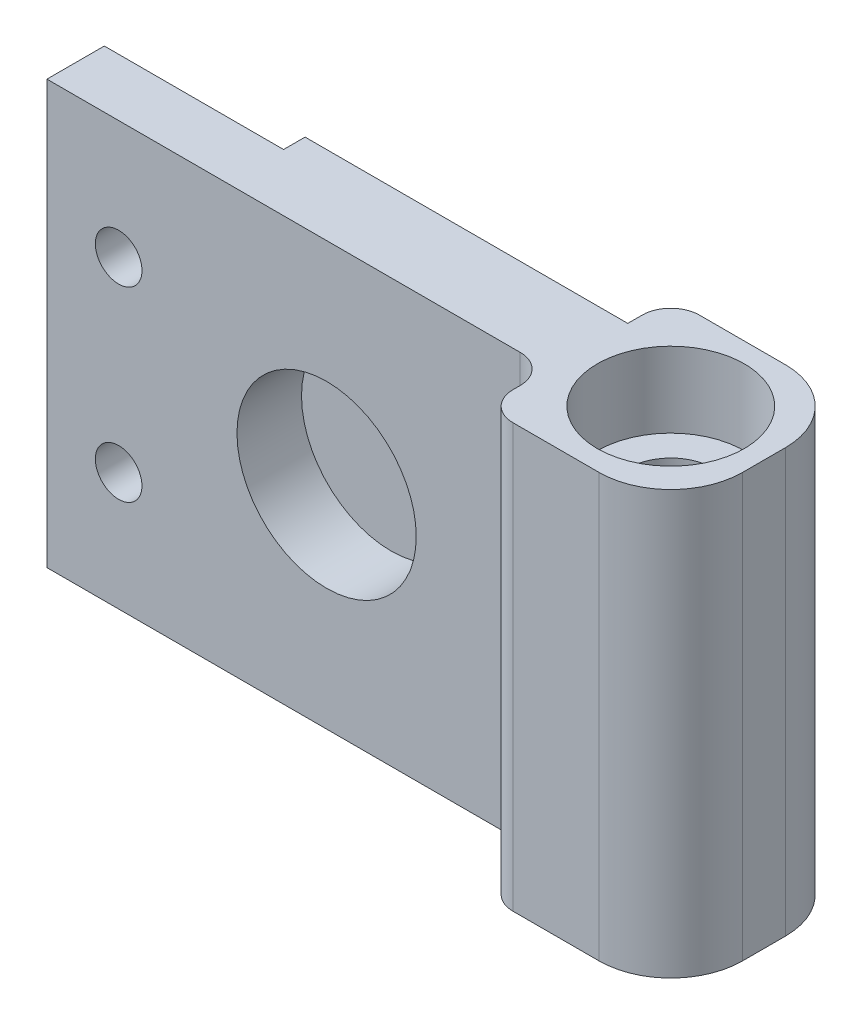
ISO-10303-21;
HEADER;
FILE_DESCRIPTION(('STEP AP214'),'2;1');
FILE_NAME('part.step','',(''),(''),'','','');
FILE_SCHEMA(('AUTOMOTIVE_DESIGN { 1 0 10303 214 1 1 1 1 }'));
ENDSEC;
DATA;
#1=APPLICATION_CONTEXT('core data for automotive mechanical design processes');
#2=APPLICATION_PROTOCOL_DEFINITION('international standard','automotive_design',2000,#1);
#3=PRODUCT_CONTEXT('',#1,'mechanical');
#4=PRODUCT('Part','Part','',(#3));
#5=PRODUCT_RELATED_PRODUCT_CATEGORY('part','',(#4));
#6=PRODUCT_DEFINITION_FORMATION('','',#4);
#7=PRODUCT_DEFINITION_CONTEXT('part definition',#1,'design');
#8=PRODUCT_DEFINITION('design','',#6,#7);
#9=PRODUCT_DEFINITION_SHAPE('','',#8);
#10=(LENGTH_UNIT() NAMED_UNIT(*) SI_UNIT(.MILLI.,.METRE.));
#11=(NAMED_UNIT(*) PLANE_ANGLE_UNIT() SI_UNIT($,.RADIAN.));
#12=(NAMED_UNIT(*) SI_UNIT($,.STERADIAN.) SOLID_ANGLE_UNIT());
#13=UNCERTAINTY_MEASURE_WITH_UNIT(LENGTH_MEASURE(1.E-05),#10,'distance_accuracy_value','');
#14=(GEOMETRIC_REPRESENTATION_CONTEXT(3) GLOBAL_UNCERTAINTY_ASSIGNED_CONTEXT((#13)) GLOBAL_UNIT_ASSIGNED_CONTEXT((#10,
#11,#12)) REPRESENTATION_CONTEXT('',''));
#15=CARTESIAN_POINT('',(0.,0.,0.));
#16=DIRECTION('',(0.,0.,1.));
#17=DIRECTION('',(1.,0.,0.));
#18=AXIS2_PLACEMENT_3D('',#15,#16,#17);
#19=CARTESIAN_POINT('',(-6.5,64.7278299076171,2.00000000000001));
#20=DIRECTION('',(0.,0.,1.));
#21=DIRECTION('',(1.,0.,0.));
#22=AXIS2_PLACEMENT_3D('',#19,#20,#21);
#23=PLANE('',#22);
#24=DIRECTION('',(-1.,0.,0.));
#25=VECTOR('',#24,1.);
#26=CARTESIAN_POINT('',(-6.5,0.,2.00000000000001));
#27=LINE('',#26,#25);
#28=CARTESIAN_POINT('',(-8.5,0.,2.));
#29=VERTEX_POINT('',#28);
#30=CARTESIAN_POINT('',(-41.5,0.,1.99999999999999));
#31=VERTEX_POINT('',#30);
#32=EDGE_CURVE('E197',#29,#31,#27,.T.);
#33=ORIENTED_EDGE('',*,*,#32,.F.);
#34=DIRECTION('',(0.,1.,0.));
#35=VECTOR('',#34,1.);
#36=CARTESIAN_POINT('',(-8.5,64.7278299076171,2.));
#37=LINE('',#36,#35);
#38=CARTESIAN_POINT('',(-8.5,29.5,2.));
#39=VERTEX_POINT('',#38);
#40=EDGE_CURVE('E243',#29,#39,#37,.T.);
#41=ORIENTED_EDGE('',*,*,#40,.T.);
#42=DIRECTION('',(-1.,0.,0.));
#43=VECTOR('',#42,1.);
#44=CARTESIAN_POINT('',(-6.5,29.5,2.00000000000001));
#45=LINE('',#44,#43);
#46=CARTESIAN_POINT('',(-41.5,29.5,1.99999999999999));
#47=VERTEX_POINT('',#46);
#48=EDGE_CURVE('E213',#39,#47,#45,.T.);
#49=ORIENTED_EDGE('',*,*,#48,.T.);
#50=DIRECTION('',(0.,-1.,0.));
#51=VECTOR('',#50,1.);
#52=CARTESIAN_POINT('',(-41.5,64.7278299076171,1.99999999999999));
#53=LINE('',#52,#51);
#54=EDGE_CURVE('E208',#47,#31,#53,.T.);
#55=ORIENTED_EDGE('',*,*,#54,.T.);
#56=EDGE_LOOP('',(#33,#41,#49,#55));
#57=FACE_BOUND('',#56,.T.);
#58=CARTESIAN_POINT('',(-36.5,8.25,1.99999999999999));
#59=DIRECTION('',(0.,0.,1.));
#60=DIRECTION('',(1.,0.,0.));
#61=AXIS2_PLACEMENT_3D('',#58,#59,#60);
#62=CIRCLE('',#61,1.625);
#63=CARTESIAN_POINT('',(-34.875,8.25,1.99999999999999));
#64=VERTEX_POINT('',#63);
#65=EDGE_CURVE('E178',#64,#64,#62,.F.);
#66=ORIENTED_EDGE('',*,*,#65,.T.);
#67=EDGE_LOOP('',(#66));
#68=FACE_BOUND('',#67,.T.);
#69=CARTESIAN_POINT('',(-36.5,21.25,1.99999999999999));
#70=DIRECTION('',(0.,0.,1.));
#71=DIRECTION('',(1.,0.,0.));
#72=AXIS2_PLACEMENT_3D('',#69,#70,#71);
#73=CIRCLE('',#72,1.625);
#74=CARTESIAN_POINT('',(-34.875,21.25,1.99999999999999));
#75=VERTEX_POINT('',#74);
#76=EDGE_CURVE('E168',#75,#75,#73,.F.);
#77=ORIENTED_EDGE('',*,*,#76,.T.);
#78=EDGE_LOOP('',(#77));
#79=FACE_BOUND('',#78,.T.);
#80=CARTESIAN_POINT('',(-22.,14.75,2.00000000000001));
#81=DIRECTION('',(0.,0.,-1.));
#82=DIRECTION('',(-1.,0.,0.));
#83=AXIS2_PLACEMENT_3D('',#80,#81,#82);
#84=CIRCLE('',#83,6.25);
#85=CARTESIAN_POINT('',(-28.25,14.75,2.00000000000001));
#86=VERTEX_POINT('',#85);
#87=EDGE_CURVE('E336',#86,#86,#84,.T.);
#88=ORIENTED_EDGE('',*,*,#87,.T.);
#89=EDGE_LOOP('',(#88));
#90=FACE_BOUND('',#89,.T.);
#91=ADVANCED_FACE('F37',(#57,#68,#79,#90),#23,.T.);
#92=CARTESIAN_POINT('',(-6.5,64.7278299076171,-2.00000000000001));
#93=DIRECTION('',(0.,0.,-1.));
#94=DIRECTION('',(-1.,0.,0.));
#95=AXIS2_PLACEMENT_3D('',#92,#93,#94);
#96=PLANE('',#95);
#97=CARTESIAN_POINT('',(-36.5,8.25,-2.00000000000001));
#98=DIRECTION('',(0.,0.,-1.));
#99=DIRECTION('',(-1.,0.,0.));
#100=AXIS2_PLACEMENT_3D('',#97,#98,#99);
#101=CIRCLE('',#100,1.625);
#102=CARTESIAN_POINT('',(-38.125,8.25,-2.00000000000001));
#103=VERTEX_POINT('',#102);
#104=EDGE_CURVE('E175',#103,#103,#101,.T.);
#105=ORIENTED_EDGE('',*,*,#104,.F.);
#106=EDGE_LOOP('',(#105));
#107=FACE_BOUND('',#106,.T.);
#108=CARTESIAN_POINT('',(-36.5,21.25,-2.00000000000001));
#109=DIRECTION('',(0.,0.,-1.));
#110=DIRECTION('',(1.,0.,0.));
#111=AXIS2_PLACEMENT_3D('',#108,#109,#110);
#112=CIRCLE('',#111,1.625);
#113=CARTESIAN_POINT('',(-34.875,21.25,-2.00000000000001));
#114=VERTEX_POINT('',#113);
#115=EDGE_CURVE('E164',#114,#114,#112,.T.);
#116=ORIENTED_EDGE('',*,*,#115,.F.);
#117=EDGE_LOOP('',(#116));
#118=FACE_BOUND('',#117,.T.);
#119=DIRECTION('',(1.,0.,0.));
#120=VECTOR('',#119,1.);
#121=CARTESIAN_POINT('',(-6.5,29.5,-2.00000000000001));
#122=LINE('',#121,#120);
#123=CARTESIAN_POINT('',(-41.5,29.5,-2.00000000000001));
#124=VERTEX_POINT('',#123);
#125=CARTESIAN_POINT('',(-29.,29.5,-2.00000000000001));
#126=VERTEX_POINT('',#125);
#127=EDGE_CURVE('E210',#124,#126,#122,.T.);
#128=ORIENTED_EDGE('',*,*,#127,.T.);
#129=DIRECTION('',(0.,1.,0.));
#130=VECTOR('',#129,1.);
#131=CARTESIAN_POINT('',(-29.,0.,-2.00000000000001));
#132=LINE('',#131,#130);
#133=CARTESIAN_POINT('',(-29.,0.,-2.00000000000001));
#134=VERTEX_POINT('',#133);
#135=EDGE_CURVE('E159',#134,#126,#132,.T.);
#136=ORIENTED_EDGE('',*,*,#135,.F.);
#137=DIRECTION('',(1.,0.,0.));
#138=VECTOR('',#137,1.);
#139=CARTESIAN_POINT('',(-6.5,0.,-2.00000000000001));
#140=LINE('',#139,#138);
#141=CARTESIAN_POINT('',(-41.5,0.,-2.00000000000001));
#142=VERTEX_POINT('',#141);
#143=EDGE_CURVE('E203',#142,#134,#140,.T.);
#144=ORIENTED_EDGE('',*,*,#143,.F.);
#145=DIRECTION('',(0.,-1.,0.));
#146=VECTOR('',#145,1.);
#147=CARTESIAN_POINT('',(-41.5,64.7278299076171,-2.00000000000001));
#148=LINE('',#147,#146);
#149=EDGE_CURVE('E207',#124,#142,#148,.T.);
#150=ORIENTED_EDGE('',*,*,#149,.F.);
#151=EDGE_LOOP('',(#128,#136,#144,#150));
#152=FACE_BOUND('',#151,.T.);
#153=ADVANCED_FACE('F333',(#107,#118,#152),#96,.T.);
#154=CARTESIAN_POINT('',(-8.5,64.7278299076171,4.));
#155=DIRECTION('',(0.,1.,0.));
#156=DIRECTION('',(0.,0.,1.));
#157=AXIS2_PLACEMENT_3D('',#154,#155,#156);
#158=CYLINDRICAL_SURFACE('',#157,2.);
#159=ORIENTED_EDGE('',*,*,#40,.F.);
#160=CARTESIAN_POINT('',(-8.5,0.,4.));
#161=DIRECTION('',(0.,1.,0.));
#162=DIRECTION('',(0.,0.,1.));
#163=AXIS2_PLACEMENT_3D('',#160,#161,#162);
#164=CIRCLE('',#163,2.);
#165=CARTESIAN_POINT('',(-6.5,0.,4.));
#166=VERTEX_POINT('',#165);
#167=EDGE_CURVE('E45',#29,#166,#164,.F.);
#168=ORIENTED_EDGE('',*,*,#167,.T.);
#169=DIRECTION('',(0.,1.,0.));
#170=VECTOR('',#169,1.);
#171=CARTESIAN_POINT('',(-6.5,29.5,4.));
#172=LINE('',#171,#170);
#173=CARTESIAN_POINT('',(-6.5,29.5,4.));
#174=VERTEX_POINT('',#173);
#175=EDGE_CURVE('E246',#174,#166,#172,.F.);
#176=ORIENTED_EDGE('',*,*,#175,.F.);
#177=CARTESIAN_POINT('',(-8.5,29.5,4.));
#178=DIRECTION('',(0.,1.,0.));
#179=DIRECTION('',(0.,0.,1.));
#180=AXIS2_PLACEMENT_3D('',#177,#178,#179);
#181=CIRCLE('',#180,2.);
#182=EDGE_CURVE('E12',#174,#39,#181,.T.);
#183=ORIENTED_EDGE('',*,*,#182,.T.);
#184=EDGE_LOOP('',(#159,#168,#176,#183));
#185=FACE_BOUND('',#184,.T.);
#186=ADVANCED_FACE('F39',(#185),#158,.F.);
#187=CARTESIAN_POINT('',(-4.5,29.5,4.5));
#188=DIRECTION('',(0.,-1.,0.));
#189=DIRECTION('',(0.,0.,-1.));
#190=AXIS2_PLACEMENT_3D('',#187,#188,#189);
#191=CYLINDRICAL_SURFACE('',#190,2.);
#192=DIRECTION('',(0.,-1.,0.));
#193=VECTOR('',#192,1.);
#194=CARTESIAN_POINT('',(-4.5,29.5,6.5));
#195=LINE('',#194,#193);
#196=CARTESIAN_POINT('',(-4.5,29.5,6.5));
#197=VERTEX_POINT('',#196);
#198=CARTESIAN_POINT('',(-4.5,0.,6.5));
#199=VERTEX_POINT('',#198);
#200=EDGE_CURVE('E301',#197,#199,#195,.T.);
#201=ORIENTED_EDGE('',*,*,#200,.F.);
#202=CARTESIAN_POINT('',(-4.5,29.5,4.5));
#203=DIRECTION('',(0.,1.,0.));
#204=DIRECTION('',(0.,0.,1.));
#205=AXIS2_PLACEMENT_3D('',#202,#203,#204);
#206=CIRCLE('',#205,2.);
#207=CARTESIAN_POINT('',(-6.5,29.5,4.5));
#208=VERTEX_POINT('',#207);
#209=EDGE_CURVE('E309',#208,#197,#206,.T.);
#210=ORIENTED_EDGE('',*,*,#209,.F.);
#211=DIRECTION('',(0.,-1.,0.));
#212=VECTOR('',#211,1.);
#213=CARTESIAN_POINT('',(-6.5,29.5,4.5));
#214=LINE('',#213,#212);
#215=CARTESIAN_POINT('',(-6.5,0.,4.5));
#216=VERTEX_POINT('',#215);
#217=EDGE_CURVE('E306',#216,#208,#214,.F.);
#218=ORIENTED_EDGE('',*,*,#217,.F.);
#219=CARTESIAN_POINT('',(-4.5,0.,4.5));
#220=DIRECTION('',(0.,1.,0.));
#221=DIRECTION('',(0.,0.,1.));
#222=AXIS2_PLACEMENT_3D('',#219,#220,#221);
#223=CIRCLE('',#222,2.);
#224=EDGE_CURVE('E247',#199,#216,#223,.F.);
#225=ORIENTED_EDGE('',*,*,#224,.F.);
#226=EDGE_LOOP('',(#201,#210,#218,#225));
#227=FACE_BOUND('',#226,.T.);
#228=ADVANCED_FACE('F318',(#227),#191,.T.);
#229=CARTESIAN_POINT('',(-4.5,29.5,-4.5));
#230=DIRECTION('',(0.,1.,0.));
#231=DIRECTION('',(0.,0.,1.));
#232=AXIS2_PLACEMENT_3D('',#229,#230,#231);
#233=CYLINDRICAL_SURFACE('',#232,2.);
#234=DIRECTION('',(0.,1.,0.));
#235=VECTOR('',#234,1.);
#236=CARTESIAN_POINT('',(-4.5,29.5,-6.5));
#237=LINE('',#236,#235);
#238=CARTESIAN_POINT('',(-4.5,0.,-6.5));
#239=VERTEX_POINT('',#238);
#240=CARTESIAN_POINT('',(-4.5,29.5,-6.5));
#241=VERTEX_POINT('',#240);
#242=EDGE_CURVE('E226',#239,#241,#237,.T.);
#243=ORIENTED_EDGE('',*,*,#242,.F.);
#244=CARTESIAN_POINT('',(-4.5,0.,-4.5));
#245=DIRECTION('',(0.,1.,0.));
#246=DIRECTION('',(0.,0.,1.));
#247=AXIS2_PLACEMENT_3D('',#244,#245,#246);
#248=CIRCLE('',#247,2.);
#249=CARTESIAN_POINT('',(-6.5,0.,-4.5));
#250=VERTEX_POINT('',#249);
#251=EDGE_CURVE('E295',#250,#239,#248,.F.);
#252=ORIENTED_EDGE('',*,*,#251,.F.);
#253=DIRECTION('',(0.,1.,0.));
#254=VECTOR('',#253,1.);
#255=CARTESIAN_POINT('',(-6.5,29.5,-4.5));
#256=LINE('',#255,#254);
#257=CARTESIAN_POINT('',(-6.5,29.5,-4.5));
#258=VERTEX_POINT('',#257);
#259=EDGE_CURVE('E234',#258,#250,#256,.F.);
#260=ORIENTED_EDGE('',*,*,#259,.F.);
#261=CARTESIAN_POINT('',(-4.5,29.5,-4.5));
#262=DIRECTION('',(0.,1.,0.));
#263=DIRECTION('',(0.,0.,1.));
#264=AXIS2_PLACEMENT_3D('',#261,#262,#263);
#265=CIRCLE('',#264,2.);
#266=EDGE_CURVE('E299',#241,#258,#265,.T.);
#267=ORIENTED_EDGE('',*,*,#266,.F.);
#268=EDGE_LOOP('',(#243,#252,#260,#267));
#269=FACE_BOUND('',#268,.T.);
#270=ADVANCED_FACE('F391',(#269),#233,.T.);
#271=CARTESIAN_POINT('',(1.5,29.5,1.5));
#272=DIRECTION('',(0.,-1.,0.));
#273=DIRECTION('',(0.,0.,-1.));
#274=AXIS2_PLACEMENT_3D('',#271,#272,#273);
#275=CYLINDRICAL_SURFACE('',#274,5.);
#276=DIRECTION('',(0.,-1.,0.));
#277=VECTOR('',#276,1.);
#278=CARTESIAN_POINT('',(6.5,29.5,1.5));
#279=LINE('',#278,#277);
#280=CARTESIAN_POINT('',(6.5,29.5,1.5));
#281=VERTEX_POINT('',#280);
#282=CARTESIAN_POINT('',(6.5,0.,1.5));
#283=VERTEX_POINT('',#282);
#284=EDGE_CURVE('E275',#281,#283,#279,.T.);
#285=ORIENTED_EDGE('',*,*,#284,.F.);
#286=CARTESIAN_POINT('',(1.5,29.5,1.5));
#287=DIRECTION('',(0.,1.,0.));
#288=DIRECTION('',(0.,0.,1.));
#289=AXIS2_PLACEMENT_3D('',#286,#287,#288);
#290=CIRCLE('',#289,5.);
#291=CARTESIAN_POINT('',(1.5,29.5,6.5));
#292=VERTEX_POINT('',#291);
#293=EDGE_CURVE('E281',#292,#281,#290,.T.);
#294=ORIENTED_EDGE('',*,*,#293,.F.);
#295=DIRECTION('',(0.,-1.,0.));
#296=VECTOR('',#295,1.);
#297=CARTESIAN_POINT('',(1.5,29.5,6.5));
#298=LINE('',#297,#296);
#299=CARTESIAN_POINT('',(1.5,0.,6.5));
#300=VERTEX_POINT('',#299);
#301=EDGE_CURVE('E278',#300,#292,#298,.F.);
#302=ORIENTED_EDGE('',*,*,#301,.F.);
#303=CARTESIAN_POINT('',(1.5,0.,1.5));
#304=DIRECTION('',(0.,1.,0.));
#305=DIRECTION('',(0.,0.,1.));
#306=AXIS2_PLACEMENT_3D('',#303,#304,#305);
#307=CIRCLE('',#306,5.);
#308=EDGE_CURVE('E282',#283,#300,#307,.F.);
#309=ORIENTED_EDGE('',*,*,#308,.F.);
#310=EDGE_LOOP('',(#285,#294,#302,#309));
#311=FACE_BOUND('',#310,.T.);
#312=ADVANCED_FACE('F387',(#311),#275,.T.);
#313=CARTESIAN_POINT('',(1.5,29.5,-1.5));
#314=DIRECTION('',(0.,-1.,0.));
#315=DIRECTION('',(0.,0.,-1.));
#316=AXIS2_PLACEMENT_3D('',#313,#314,#315);
#317=CYLINDRICAL_SURFACE('',#316,5.);
#318=DIRECTION('',(0.,-1.,0.));
#319=VECTOR('',#318,1.);
#320=CARTESIAN_POINT('',(1.5,29.5,-6.5));
#321=LINE('',#320,#319);
#322=CARTESIAN_POINT('',(1.5,29.5,-6.5));
#323=VERTEX_POINT('',#322);
#324=CARTESIAN_POINT('',(1.5,0.,-6.5));
#325=VERTEX_POINT('',#324);
#326=EDGE_CURVE('E264',#323,#325,#321,.T.);
#327=ORIENTED_EDGE('',*,*,#326,.F.);
#328=CARTESIAN_POINT('',(1.5,29.5,-1.5));
#329=DIRECTION('',(0.,1.,0.));
#330=DIRECTION('',(0.,0.,1.));
#331=AXIS2_PLACEMENT_3D('',#328,#329,#330);
#332=CIRCLE('',#331,5.);
#333=CARTESIAN_POINT('',(6.5,29.5,-1.5));
#334=VERTEX_POINT('',#333);
#335=EDGE_CURVE('E270',#334,#323,#332,.T.);
#336=ORIENTED_EDGE('',*,*,#335,.F.);
#337=DIRECTION('',(0.,-1.,0.));
#338=VECTOR('',#337,1.);
#339=CARTESIAN_POINT('',(6.5,29.5,-1.5));
#340=LINE('',#339,#338);
#341=CARTESIAN_POINT('',(6.5,0.,-1.5));
#342=VERTEX_POINT('',#341);
#343=EDGE_CURVE('E267',#342,#334,#340,.F.);
#344=ORIENTED_EDGE('',*,*,#343,.F.);
#345=CARTESIAN_POINT('',(1.5,0.,-1.5));
#346=DIRECTION('',(0.,1.,0.));
#347=DIRECTION('',(0.,0.,1.));
#348=AXIS2_PLACEMENT_3D('',#345,#346,#347);
#349=CIRCLE('',#348,5.);
#350=EDGE_CURVE('E272',#325,#342,#349,.F.);
#351=ORIENTED_EDGE('',*,*,#350,.F.);
#352=EDGE_LOOP('',(#327,#336,#344,#351));
#353=FACE_BOUND('',#352,.T.);
#354=ADVANCED_FACE('F384',(#353),#317,.T.);
#355=CARTESIAN_POINT('',(-6.5,29.5,6.5));
#356=DIRECTION('',(1.,0.,0.));
#357=DIRECTION('',(0.,0.,-1.));
#358=AXIS2_PLACEMENT_3D('',#355,#356,#357);
#359=PLANE('',#358);
#360=DIRECTION('',(0.,0.,1.));
#361=VECTOR('',#360,1.);
#362=CARTESIAN_POINT('',(-6.5,0.,6.5));
#363=LINE('',#362,#361);
#364=CARTESIAN_POINT('',(-6.5,0.,-3.50000000000001));
#365=VERTEX_POINT('',#364);
#366=EDGE_CURVE('E228',#250,#365,#363,.T.);
#367=ORIENTED_EDGE('',*,*,#366,.T.);
#368=DIRECTION('',(0.,-1.,0.));
#369=VECTOR('',#368,1.);
#370=CARTESIAN_POINT('',(-6.5,0.,-3.50000000000001));
#371=LINE('',#370,#369);
#372=CARTESIAN_POINT('',(-6.5,29.5,-3.50000000000001));
#373=VERTEX_POINT('',#372);
#374=EDGE_CURVE('E150',#373,#365,#371,.T.);
#375=ORIENTED_EDGE('',*,*,#374,.F.);
#376=DIRECTION('',(0.,0.,1.));
#377=VECTOR('',#376,1.);
#378=CARTESIAN_POINT('',(-6.5,29.5,6.5));
#379=LINE('',#378,#377);
#380=EDGE_CURVE('E147',#258,#373,#379,.T.);
#381=ORIENTED_EDGE('',*,*,#380,.F.);
#382=ORIENTED_EDGE('',*,*,#259,.T.);
#383=EDGE_LOOP('',(#367,#375,#381,#382));
#384=FACE_BOUND('',#383,.T.);
#385=ADVANCED_FACE('F383',(#384),#359,.F.);
#386=EDGE_CURVE('E220',#174,#208,#379,.T.);
#387=ORIENTED_EDGE('',*,*,#386,.F.);
#388=ORIENTED_EDGE('',*,*,#175,.T.);
#389=EDGE_CURVE('E233',#166,#216,#363,.T.);
#390=ORIENTED_EDGE('',*,*,#389,.T.);
#391=ORIENTED_EDGE('',*,*,#217,.T.);
#392=EDGE_LOOP('',(#387,#388,#390,#391));
#393=FACE_BOUND('',#392,.T.);
#394=ADVANCED_FACE('F321',(#393),#359,.F.);
#395=CARTESIAN_POINT('',(6.5,29.5,6.5));
#396=DIRECTION('',(0.,0.,-1.));
#397=DIRECTION('',(-1.,0.,0.));
#398=AXIS2_PLACEMENT_3D('',#395,#396,#397);
#399=PLANE('',#398);
#400=DIRECTION('',(1.,0.,0.));
#401=VECTOR('',#400,1.);
#402=CARTESIAN_POINT('',(6.5,29.5,6.5));
#403=LINE('',#402,#401);
#404=EDGE_CURVE('E216',#197,#292,#403,.T.);
#405=ORIENTED_EDGE('',*,*,#404,.F.);
#406=ORIENTED_EDGE('',*,*,#200,.T.);
#407=DIRECTION('',(1.,0.,0.));
#408=VECTOR('',#407,1.);
#409=CARTESIAN_POINT('',(6.5,0.,6.5));
#410=LINE('',#409,#408);
#411=EDGE_CURVE('E232',#199,#300,#410,.T.);
#412=ORIENTED_EDGE('',*,*,#411,.T.);
#413=ORIENTED_EDGE('',*,*,#301,.T.);
#414=EDGE_LOOP('',(#405,#406,#412,#413));
#415=FACE_BOUND('',#414,.T.);
#416=ADVANCED_FACE('F376',(#415),#399,.F.);
#417=CARTESIAN_POINT('',(6.5,29.5,6.5));
#418=DIRECTION('',(-1.,0.,0.));
#419=DIRECTION('',(0.,0.,1.));
#420=AXIS2_PLACEMENT_3D('',#417,#418,#419);
#421=PLANE('',#420);
#422=DIRECTION('',(0.,0.,-1.));
#423=VECTOR('',#422,1.);
#424=CARTESIAN_POINT('',(6.5,29.5,6.5));
#425=LINE('',#424,#423);
#426=EDGE_CURVE('E617',#281,#334,#425,.T.);
#427=ORIENTED_EDGE('',*,*,#426,.F.);
#428=ORIENTED_EDGE('',*,*,#284,.T.);
#429=DIRECTION('',(0.,0.,-1.));
#430=VECTOR('',#429,1.);
#431=CARTESIAN_POINT('',(6.5,0.,6.5));
#432=LINE('',#431,#430);
#433=EDGE_CURVE('E614',#283,#342,#432,.T.);
#434=ORIENTED_EDGE('',*,*,#433,.T.);
#435=ORIENTED_EDGE('',*,*,#343,.T.);
#436=EDGE_LOOP('',(#427,#428,#434,#435));
#437=FACE_BOUND('',#436,.T.);
#438=ADVANCED_FACE('F373',(#437),#421,.F.);
#439=CARTESIAN_POINT('',(6.5,29.5,-6.5));
#440=DIRECTION('',(0.,0.,1.));
#441=DIRECTION('',(1.,0.,0.));
#442=AXIS2_PLACEMENT_3D('',#439,#440,#441);
#443=PLANE('',#442);
#444=DIRECTION('',(-1.,0.,0.));
#445=VECTOR('',#444,1.);
#446=CARTESIAN_POINT('',(6.5,0.,-6.5));
#447=LINE('',#446,#445);
#448=EDGE_CURVE('E254',#325,#239,#447,.T.);
#449=ORIENTED_EDGE('',*,*,#448,.T.);
#450=ORIENTED_EDGE('',*,*,#242,.T.);
#451=DIRECTION('',(-1.,0.,0.));
#452=VECTOR('',#451,1.);
#453=CARTESIAN_POINT('',(6.5,29.5,-6.5));
#454=LINE('',#453,#452);
#455=EDGE_CURVE('E239',#323,#241,#454,.T.);
#456=ORIENTED_EDGE('',*,*,#455,.F.);
#457=ORIENTED_EDGE('',*,*,#326,.T.);
#458=EDGE_LOOP('',(#449,#450,#456,#457));
#459=FACE_BOUND('',#458,.T.);
#460=ADVANCED_FACE('F368',(#459),#443,.F.);
#461=CARTESIAN_POINT('',(0.,29.5,0.));
#462=DIRECTION('',(0.,1.,0.));
#463=DIRECTION('',(0.,0.,1.));
#464=AXIS2_PLACEMENT_3D('',#461,#462,#463);
#465=PLANE('',#464);
#466=ORIENTED_EDGE('',*,*,#182,.F.);
#467=ORIENTED_EDGE('',*,*,#386,.T.);
#468=ORIENTED_EDGE('',*,*,#209,.T.);
#469=ORIENTED_EDGE('',*,*,#404,.T.);
#470=ORIENTED_EDGE('',*,*,#293,.T.);
#471=ORIENTED_EDGE('',*,*,#426,.T.);
#472=ORIENTED_EDGE('',*,*,#335,.T.);
#473=ORIENTED_EDGE('',*,*,#455,.T.);
#474=ORIENTED_EDGE('',*,*,#266,.T.);
#475=ORIENTED_EDGE('',*,*,#380,.T.);
#476=DIRECTION('',(1.,0.,0.));
#477=VECTOR('',#476,1.);
#478=CARTESIAN_POINT('',(-29.,29.5,-3.50000000000001));
#479=LINE('',#478,#477);
#480=CARTESIAN_POINT('',(-29.,29.5,-3.50000000000001));
#481=VERTEX_POINT('',#480);
#482=EDGE_CURVE('E139',#481,#373,#479,.T.);
#483=ORIENTED_EDGE('',*,*,#482,.F.);
#484=DIRECTION('',(0.,0.,1.));
#485=VECTOR('',#484,1.);
#486=CARTESIAN_POINT('',(-29.,29.5,-3.50000000000001));
#487=LINE('',#486,#485);
#488=EDGE_CURVE('E144',#481,#126,#487,.T.);
#489=ORIENTED_EDGE('',*,*,#488,.T.);
#490=ORIENTED_EDGE('',*,*,#127,.F.);
#491=DIRECTION('',(0.,0.,-1.));
#492=VECTOR('',#491,1.);
#493=CARTESIAN_POINT('',(-41.5,29.5,-2.00000000000001));
#494=LINE('',#493,#492);
#495=EDGE_CURVE('E204',#47,#124,#494,.T.);
#496=ORIENTED_EDGE('',*,*,#495,.F.);
#497=ORIENTED_EDGE('',*,*,#48,.F.);
#498=EDGE_LOOP('',(#466,#467,#468,#469,#470,#471,#472,#473,#474,#475,#483,#489,#490,#496,#497));
#499=FACE_BOUND('',#498,.T.);
#500=CARTESIAN_POINT('',(0.,29.5,0.));
#501=DIRECTION('',(0.,1.,0.));
#502=DIRECTION('',(0.,0.,1.));
#503=AXIS2_PLACEMENT_3D('',#500,#501,#502);
#504=CIRCLE('',#503,5.125);
#505=CARTESIAN_POINT('',(0.,29.5,5.125));
#506=VERTEX_POINT('',#505);
#507=EDGE_CURVE('E191',#506,#506,#504,.T.);
#508=ORIENTED_EDGE('',*,*,#507,.F.);
#509=EDGE_LOOP('',(#508));
#510=FACE_BOUND('',#509,.T.);
#511=ADVANCED_FACE('F141',(#499,#510),#465,.T.);
#512=CARTESIAN_POINT('',(0.,0.,0.));
#513=DIRECTION('',(0.,1.,0.));
#514=DIRECTION('',(0.,0.,1.));
#515=AXIS2_PLACEMENT_3D('',#512,#513,#514);
#516=PLANE('',#515);
#517=ORIENTED_EDGE('',*,*,#167,.F.);
#518=ORIENTED_EDGE('',*,*,#32,.T.);
#519=DIRECTION('',(0.,0.,-1.));
#520=VECTOR('',#519,1.);
#521=CARTESIAN_POINT('',(-41.5,0.,-2.00000000000001));
#522=LINE('',#521,#520);
#523=EDGE_CURVE('E200',#31,#142,#522,.T.);
#524=ORIENTED_EDGE('',*,*,#523,.T.);
#525=ORIENTED_EDGE('',*,*,#143,.T.);
#526=DIRECTION('',(0.,0.,1.));
#527=VECTOR('',#526,1.);
#528=CARTESIAN_POINT('',(-29.,0.,-3.50000000000001));
#529=LINE('',#528,#527);
#530=CARTESIAN_POINT('',(-29.,0.,-3.50000000000001));
#531=VERTEX_POINT('',#530);
#532=EDGE_CURVE('E165',#531,#134,#529,.T.);
#533=ORIENTED_EDGE('',*,*,#532,.F.);
#534=DIRECTION('',(-1.,0.,0.));
#535=VECTOR('',#534,1.);
#536=CARTESIAN_POINT('',(-29.,0.,-3.50000000000001));
#537=LINE('',#536,#535);
#538=EDGE_CURVE('E156',#365,#531,#537,.T.);
#539=ORIENTED_EDGE('',*,*,#538,.F.);
#540=ORIENTED_EDGE('',*,*,#366,.F.);
#541=ORIENTED_EDGE('',*,*,#251,.T.);
#542=ORIENTED_EDGE('',*,*,#448,.F.);
#543=ORIENTED_EDGE('',*,*,#350,.T.);
#544=ORIENTED_EDGE('',*,*,#433,.F.);
#545=ORIENTED_EDGE('',*,*,#308,.T.);
#546=ORIENTED_EDGE('',*,*,#411,.F.);
#547=ORIENTED_EDGE('',*,*,#224,.T.);
#548=ORIENTED_EDGE('',*,*,#389,.F.);
#549=EDGE_LOOP('',(#517,#518,#524,#525,#533,#539,#540,#541,#542,#543,#544,#545,#546,#547,#548));
#550=FACE_BOUND('',#549,.T.);
#551=CARTESIAN_POINT('',(0.,0.,0.));
#552=DIRECTION('',(0.,-1.,0.));
#553=DIRECTION('',(0.,0.,-1.));
#554=AXIS2_PLACEMENT_3D('',#551,#552,#553);
#555=CIRCLE('',#554,5.125);
#556=CARTESIAN_POINT('',(0.,0.,-5.125));
#557=VERTEX_POINT('',#556);
#558=EDGE_CURVE('E187',#557,#557,#555,.T.);
#559=ORIENTED_EDGE('',*,*,#558,.F.);
#560=EDGE_LOOP('',(#559));
#561=FACE_BOUND('',#560,.T.);
#562=ADVANCED_FACE('F313',(#550,#561),#516,.F.);
#563=CARTESIAN_POINT('',(-41.5,64.7278299076171,-2.00000000000001));
#564=DIRECTION('',(-1.,0.,0.));
#565=DIRECTION('',(0.,0.,1.));
#566=AXIS2_PLACEMENT_3D('',#563,#564,#565);
#567=PLANE('',#566);
#568=ORIENTED_EDGE('',*,*,#54,.F.);
#569=ORIENTED_EDGE('',*,*,#495,.T.);
#570=ORIENTED_EDGE('',*,*,#149,.T.);
#571=ORIENTED_EDGE('',*,*,#523,.F.);
#572=EDGE_LOOP('',(#568,#569,#570,#571));
#573=FACE_BOUND('',#572,.T.);
#574=ADVANCED_FACE('F330',(#573),#567,.T.);
#575=CARTESIAN_POINT('',(0.,24.25,0.));
#576=DIRECTION('',(0.,1.,0.));
#577=DIRECTION('',(0.,0.,1.));
#578=AXIS2_PLACEMENT_3D('',#575,#576,#577);
#579=CYLINDRICAL_SURFACE('',#578,5.125);
#580=CARTESIAN_POINT('',(0.,24.25,0.));
#581=DIRECTION('',(0.,1.,0.));
#582=DIRECTION('',(0.,0.,1.));
#583=AXIS2_PLACEMENT_3D('',#580,#581,#582);
#584=CIRCLE('',#583,5.125);
#585=CARTESIAN_POINT('',(0.,24.25,5.125));
#586=VERTEX_POINT('',#585);
#587=EDGE_CURVE('E194',#586,#586,#584,.T.);
#588=CARTESIAN_POINT('',(0.,24.25,5.125));
#589=CARTESIAN_POINT('',(0.,24.3046875,5.125));
#590=CARTESIAN_POINT('',(0.,24.359375,5.125));
#591=CARTESIAN_POINT('',(0.,24.46875,5.125));
#592=CARTESIAN_POINT('',(0.,24.5234375,5.125));
#593=CARTESIAN_POINT('',(0.,24.6328125,5.125));
#594=CARTESIAN_POINT('',(0.,24.6875,5.125));
#595=CARTESIAN_POINT('',(0.,24.796875,5.125));
#596=CARTESIAN_POINT('',(0.,24.8515625,5.125));
#597=CARTESIAN_POINT('',(0.,24.9609375,5.125));
#598=CARTESIAN_POINT('',(0.,25.015625,5.125));
#599=CARTESIAN_POINT('',(0.,25.125,5.125));
#600=CARTESIAN_POINT('',(0.,25.1796875,5.125));
#601=CARTESIAN_POINT('',(0.,25.2890625,5.125));
#602=CARTESIAN_POINT('',(0.,25.34375,5.125));
#603=CARTESIAN_POINT('',(0.,25.453125,5.125));
#604=CARTESIAN_POINT('',(0.,25.5078125,5.125));
#605=CARTESIAN_POINT('',(0.,25.6171875,5.125));
#606=CARTESIAN_POINT('',(0.,25.671875,5.125));
#607=CARTESIAN_POINT('',(0.,25.78125,5.125));
#608=CARTESIAN_POINT('',(0.,25.8359375,5.125));
#609=CARTESIAN_POINT('',(0.,25.9453125,5.125));
#610=CARTESIAN_POINT('',(0.,26.,5.125));
#611=CARTESIAN_POINT('',(0.,26.109375,5.125));
#612=CARTESIAN_POINT('',(0.,26.1640625,5.125));
#613=CARTESIAN_POINT('',(0.,26.2734375,5.125));
#614=CARTESIAN_POINT('',(0.,26.328125,5.125));
#615=CARTESIAN_POINT('',(0.,26.4375,5.125));
#616=CARTESIAN_POINT('',(0.,26.4921875,5.125));
#617=CARTESIAN_POINT('',(0.,26.6015625,5.125));
#618=CARTESIAN_POINT('',(0.,26.65625,5.125));
#619=CARTESIAN_POINT('',(0.,26.765625,5.125));
#620=CARTESIAN_POINT('',(0.,26.8203125,5.125));
#621=CARTESIAN_POINT('',(0.,26.9296875,5.125));
#622=CARTESIAN_POINT('',(0.,26.984375,5.125));
#623=CARTESIAN_POINT('',(0.,27.09375,5.125));
#624=CARTESIAN_POINT('',(0.,27.1484375,5.125));
#625=CARTESIAN_POINT('',(0.,27.2578125,5.125));
#626=CARTESIAN_POINT('',(0.,27.3125,5.125));
#627=CARTESIAN_POINT('',(0.,27.421875,5.125));
#628=CARTESIAN_POINT('',(0.,27.4765625,5.125));
#629=CARTESIAN_POINT('',(0.,27.5859375,5.125));
#630=CARTESIAN_POINT('',(0.,27.640625,5.125));
#631=CARTESIAN_POINT('',(0.,27.75,5.125));
#632=CARTESIAN_POINT('',(0.,27.8046875,5.125));
#633=CARTESIAN_POINT('',(0.,27.9140625,5.125));
#634=CARTESIAN_POINT('',(0.,27.96875,5.125));
#635=CARTESIAN_POINT('',(0.,28.078125,5.125));
#636=CARTESIAN_POINT('',(0.,28.1328125,5.125));
#637=CARTESIAN_POINT('',(0.,28.2421875,5.125));
#638=CARTESIAN_POINT('',(0.,28.296875,5.125));
#639=CARTESIAN_POINT('',(0.,28.40625,5.125));
#640=CARTESIAN_POINT('',(0.,28.4609375,5.125));
#641=CARTESIAN_POINT('',(0.,28.5703125,5.125));
#642=CARTESIAN_POINT('',(0.,28.625,5.125));
#643=CARTESIAN_POINT('',(0.,28.734375,5.125));
#644=CARTESIAN_POINT('',(0.,28.7890625,5.125));
#645=CARTESIAN_POINT('',(0.,28.8984375,5.125));
#646=CARTESIAN_POINT('',(0.,28.953125,5.125));
#647=CARTESIAN_POINT('',(0.,29.0625,5.125));
#648=CARTESIAN_POINT('',(0.,29.1171875,5.125));
#649=CARTESIAN_POINT('',(0.,29.2265625,5.125));
#650=CARTESIAN_POINT('',(0.,29.28125,5.125));
#651=CARTESIAN_POINT('',(0.,29.390625,5.125));
#652=CARTESIAN_POINT('',(0.,29.4453125,5.125));
#653=CARTESIAN_POINT('',(0.,29.5,5.125));
#654=B_SPLINE_CURVE_WITH_KNOTS('',3,(#588,#589,#590,#591,#592,#593,#594,#595,#596,#597,#598,
#599,#600,#601,#602,#603,#604,#605,#606,#607,#608,#609,#610,#611,#612,#613,#614,#615,#616,#617,
#618,#619,#620,#621,#622,#623,#624,#625,#626,#627,#628,#629,#630,#631,#632,#633,#634,#635,#636,
#637,#638,#639,#640,#641,#642,#643,#644,#645,#646,#647,#648,#649,#650,#651,#652,#653),
.UNSPECIFIED.,.F.,.F.,(4,2,2,2,2,2,2,2,2,2,2,2,2,2,2,2,2,2,2,2,2,2,2,2,2,2,2,2,2,2,2,2,4),(0.,
0.164062499999999,0.328124999999999,0.492187499999998,0.656249999999997,0.8203125,
0.984374999999999,1.1484375,1.3125,1.4765625,1.640625,1.8046875,1.96875,2.1328125,2.296875,
2.4609375,2.625,2.7890625,2.953125,3.1171875,3.28125,3.4453125,3.609375,3.7734375,3.9375,
4.1015625,4.265625,4.4296875,4.59375,4.7578125,4.921875,5.0859375,5.25),.UNSPECIFIED.);
#655=EDGE_CURVE('BSEAM491',#586,#506,#654,.T.);
#656=ORIENTED_EDGE('',*,*,#587,.F.);
#657=ORIENTED_EDGE('',*,*,#507,.T.);
#658=ORIENTED_EDGE('',*,*,#655,.T.);
#659=ORIENTED_EDGE('',*,*,#655,.F.);
#660=EDGE_LOOP('',(#656,#658,#657,#659));
#661=FACE_BOUND('',#660,.T.);
#662=ADVANCED_FACE('F491',(#661),#579,.F.);
#663=CARTESIAN_POINT('',(0.,24.25,0.));
#664=DIRECTION('',(0.,1.,0.));
#665=DIRECTION('',(0.,0.,1.));
#666=AXIS2_PLACEMENT_3D('',#663,#664,#665);
#667=PLANE('',#666);
#668=CARTESIAN_POINT('',(0.,24.25,0.));
#669=DIRECTION('',(0.,1.,0.));
#670=DIRECTION('',(0.,0.,1.));
#671=AXIS2_PLACEMENT_3D('',#668,#669,#670);
#672=CIRCLE('',#671,3.);
#673=CARTESIAN_POINT('',(0.,24.25,3.));
#674=VERTEX_POINT('',#673);
#675=EDGE_CURVE('E181',#674,#674,#672,.T.);
#676=ORIENTED_EDGE('',*,*,#675,.F.);
#677=EDGE_LOOP('',(#676));
#678=FACE_BOUND('',#677,.T.);
#679=ORIENTED_EDGE('',*,*,#587,.T.);
#680=EDGE_LOOP('',(#679));
#681=FACE_BOUND('',#680,.T.);
#682=ADVANCED_FACE('F487',(#678,#681),#667,.T.);
#683=CARTESIAN_POINT('',(0.,5.,0.));
#684=DIRECTION('',(0.,-1.,0.));
#685=DIRECTION('',(0.,0.,-1.));
#686=AXIS2_PLACEMENT_3D('',#683,#684,#685);
#687=CYLINDRICAL_SURFACE('',#686,5.125);
#688=CARTESIAN_POINT('',(0.,5.,0.));
#689=DIRECTION('',(0.,-1.,0.));
#690=DIRECTION('',(0.,0.,-1.));
#691=AXIS2_PLACEMENT_3D('',#688,#689,#690);
#692=CIRCLE('',#691,5.125);
#693=CARTESIAN_POINT('',(0.,5.,-5.125));
#694=VERTEX_POINT('',#693);
#695=EDGE_CURVE('E188',#694,#694,#692,.T.);
#696=ORIENTED_EDGE('',*,*,#695,.F.);
#697=EDGE_LOOP('',(#696));
#698=FACE_BOUND('',#697,.T.);
#699=ORIENTED_EDGE('',*,*,#558,.T.);
#700=EDGE_LOOP('',(#699));
#701=FACE_BOUND('',#700,.T.);
#702=ADVANCED_FACE('F483',(#698,#701),#687,.F.);
#703=CARTESIAN_POINT('',(0.,5.,0.));
#704=DIRECTION('',(0.,-1.,0.));
#705=DIRECTION('',(0.,0.,-1.));
#706=AXIS2_PLACEMENT_3D('',#703,#704,#705);
#707=PLANE('',#706);
#708=CARTESIAN_POINT('',(0.,5.,0.));
#709=DIRECTION('',(0.,-1.,0.));
#710=DIRECTION('',(0.,0.,-1.));
#711=AXIS2_PLACEMENT_3D('',#708,#709,#710);
#712=CIRCLE('',#711,3.);
#713=CARTESIAN_POINT('',(0.,5.,3.));
#714=VERTEX_POINT('',#713);
#715=EDGE_CURVE('E184',#714,#714,#712,.F.);
#716=ORIENTED_EDGE('',*,*,#715,.T.);
#717=EDGE_LOOP('',(#716));
#718=FACE_BOUND('',#717,.T.);
#719=ORIENTED_EDGE('',*,*,#695,.T.);
#720=EDGE_LOOP('',(#719));
#721=FACE_BOUND('',#720,.T.);
#722=ADVANCED_FACE('F479',(#718,#721),#707,.T.);
#723=CARTESIAN_POINT('',(0.,-3.48528137423857,0.));
#724=DIRECTION('',(0.,1.,0.));
#725=DIRECTION('',(0.,0.,1.));
#726=AXIS2_PLACEMENT_3D('',#723,#724,#725);
#727=CYLINDRICAL_SURFACE('',#726,3.);
#728=CARTESIAN_POINT('',(0.,24.25,3.));
#729=CARTESIAN_POINT('',(0.,24.0494791666667,3.));
#730=CARTESIAN_POINT('',(0.,23.8489583333333,3.));
#731=CARTESIAN_POINT('',(0.,23.4479166666667,3.));
#732=CARTESIAN_POINT('',(0.,23.2473958333333,3.));
#733=CARTESIAN_POINT('',(0.,22.8463541666667,3.));
#734=CARTESIAN_POINT('',(0.,22.6458333333333,3.));
#735=CARTESIAN_POINT('',(0.,22.2447916666667,3.));
#736=CARTESIAN_POINT('',(0.,22.0442708333333,3.));
#737=CARTESIAN_POINT('',(0.,21.6432291666667,3.));
#738=CARTESIAN_POINT('',(0.,21.4427083333333,3.));
#739=CARTESIAN_POINT('',(0.,21.0416666666667,3.));
#740=CARTESIAN_POINT('',(0.,20.8411458333333,3.));
#741=CARTESIAN_POINT('',(0.,20.4401041666667,3.));
#742=CARTESIAN_POINT('',(0.,20.2395833333333,3.));
#743=CARTESIAN_POINT('',(0.,19.8385416666667,3.));
#744=CARTESIAN_POINT('',(0.,19.6380208333333,3.));
#745=CARTESIAN_POINT('',(0.,19.2369791666667,3.));
#746=CARTESIAN_POINT('',(0.,19.0364583333333,3.));
#747=CARTESIAN_POINT('',(0.,18.6354166666667,3.));
#748=CARTESIAN_POINT('',(0.,18.4348958333333,3.));
#749=CARTESIAN_POINT('',(0.,18.0338541666667,3.));
#750=CARTESIAN_POINT('',(0.,17.8333333333333,3.));
#751=CARTESIAN_POINT('',(0.,17.4322916666667,3.));
#752=CARTESIAN_POINT('',(0.,17.2317708333333,3.));
#753=CARTESIAN_POINT('',(0.,16.8307291666667,3.));
#754=CARTESIAN_POINT('',(0.,16.6302083333333,3.));
#755=CARTESIAN_POINT('',(0.,16.2291666666667,3.));
#756=CARTESIAN_POINT('',(0.,16.0286458333333,3.));
#757=CARTESIAN_POINT('',(0.,15.6276041666667,3.));
#758=CARTESIAN_POINT('',(0.,15.4270833333333,3.));
#759=CARTESIAN_POINT('',(0.,15.0260416666667,3.));
#760=CARTESIAN_POINT('',(0.,14.8255208333333,3.));
#761=CARTESIAN_POINT('',(0.,14.4244791666667,3.));
#762=CARTESIAN_POINT('',(0.,14.2239583333333,3.));
#763=CARTESIAN_POINT('',(0.,13.8229166666667,3.));
#764=CARTESIAN_POINT('',(0.,13.6223958333333,3.));
#765=CARTESIAN_POINT('',(0.,13.2213541666667,3.));
#766=CARTESIAN_POINT('',(0.,13.0208333333333,3.));
#767=CARTESIAN_POINT('',(0.,12.6197916666667,3.));
#768=CARTESIAN_POINT('',(0.,12.4192708333333,3.));
#769=CARTESIAN_POINT('',(0.,12.0182291666667,3.));
#770=CARTESIAN_POINT('',(0.,11.8177083333333,3.));
#771=CARTESIAN_POINT('',(0.,11.4166666666667,3.));
#772=CARTESIAN_POINT('',(0.,11.2161458333333,3.));
#773=CARTESIAN_POINT('',(0.,10.8151041666667,3.));
#774=CARTESIAN_POINT('',(0.,10.6145833333333,3.));
#775=CARTESIAN_POINT('',(0.,10.2135416666667,3.));
#776=CARTESIAN_POINT('',(0.,10.0130208333333,3.));
#777=CARTESIAN_POINT('',(0.,9.61197916666667,3.));
#778=CARTESIAN_POINT('',(0.,9.41145833333333,3.));
#779=CARTESIAN_POINT('',(0.,9.01041666666667,3.));
#780=CARTESIAN_POINT('',(0.,8.80989583333333,3.));
#781=CARTESIAN_POINT('',(0.,8.40885416666667,3.));
#782=CARTESIAN_POINT('',(0.,8.20833333333334,3.));
#783=CARTESIAN_POINT('',(0.,7.80729166666667,3.));
#784=CARTESIAN_POINT('',(0.,7.60677083333333,3.));
#785=CARTESIAN_POINT('',(0.,7.20572916666667,3.));
#786=CARTESIAN_POINT('',(0.,7.00520833333333,3.));
#787=CARTESIAN_POINT('',(0.,6.60416666666667,3.));
#788=CARTESIAN_POINT('',(0.,6.40364583333333,3.));
#789=CARTESIAN_POINT('',(0.,6.00260416666667,3.));
#790=CARTESIAN_POINT('',(0.,5.80208333333334,3.));
#791=CARTESIAN_POINT('',(0.,5.40104166666667,3.));
#792=CARTESIAN_POINT('',(0.,5.20052083333334,3.));
#793=CARTESIAN_POINT('',(0.,5.,3.));
#794=B_SPLINE_CURVE_WITH_KNOTS('',3,(#728,#729,#730,#731,#732,#733,#734,#735,#736,#737,#738,
#739,#740,#741,#742,#743,#744,#745,#746,#747,#748,#749,#750,#751,#752,#753,#754,#755,#756,#757,
#758,#759,#760,#761,#762,#763,#764,#765,#766,#767,#768,#769,#770,#771,#772,#773,#774,#775,#776,
#777,#778,#779,#780,#781,#782,#783,#784,#785,#786,#787,#788,#789,#790,#791,#792,#793),
.UNSPECIFIED.,.F.,.F.,(4,2,2,2,2,2,2,2,2,2,2,2,2,2,2,2,2,2,2,2,2,2,2,2,2,2,2,2,2,2,2,2,4),(0.,
0.6015625,1.203125,1.8046875,2.40625,3.0078125,3.609375,4.2109375,4.8125,5.4140625,6.015625,
6.6171875,7.21875,7.8203125,8.42187499999999,9.02343749999999,9.62499999999999,10.2265625,
10.828125,11.4296875,12.03125,12.6328125,13.234375,13.8359375,14.4375,15.0390625,15.640625,
16.2421875,16.84375,17.4453125,18.046875,18.6484375,19.25),.UNSPECIFIED.);
#795=EDGE_CURVE('BSEAM475',#674,#714,#794,.T.);
#796=ORIENTED_EDGE('',*,*,#675,.T.);
#797=ORIENTED_EDGE('',*,*,#715,.F.);
#798=ORIENTED_EDGE('',*,*,#795,.T.);
#799=ORIENTED_EDGE('',*,*,#795,.F.);
#800=EDGE_LOOP('',(#796,#798,#797,#799));
#801=FACE_BOUND('',#800,.T.);
#802=ADVANCED_FACE('F475',(#801),#727,.F.);
#803=CARTESIAN_POINT('',(-36.5,8.25,6.59619407771256));
#804=DIRECTION('',(0.,0.,-1.));
#805=DIRECTION('',(-1.,0.,0.));
#806=AXIS2_PLACEMENT_3D('',#803,#804,#805);
#807=CYLINDRICAL_SURFACE('',#806,1.625);
#808=ORIENTED_EDGE('',*,*,#104,.T.);
#809=EDGE_LOOP('',(#808));
#810=FACE_BOUND('',#809,.T.);
#811=ORIENTED_EDGE('',*,*,#65,.F.);
#812=EDGE_LOOP('',(#811));
#813=FACE_BOUND('',#812,.T.);
#814=ADVANCED_FACE('F471',(#810,#813),#807,.F.);
#815=CARTESIAN_POINT('',(-36.5,21.25,6.59619407771256));
#816=DIRECTION('',(0.,0.,-1.));
#817=DIRECTION('',(-1.,0.,0.));
#818=AXIS2_PLACEMENT_3D('',#815,#816,#817);
#819=CYLINDRICAL_SURFACE('',#818,1.625);
#820=ORIENTED_EDGE('',*,*,#115,.T.);
#821=EDGE_LOOP('',(#820));
#822=FACE_BOUND('',#821,.T.);
#823=ORIENTED_EDGE('',*,*,#76,.F.);
#824=EDGE_LOOP('',(#823));
#825=FACE_BOUND('',#824,.T.);
#826=ADVANCED_FACE('F415',(#822,#825),#819,.F.);
#827=CARTESIAN_POINT('',(-29.,0.,-3.50000000000001));
#828=DIRECTION('',(1.,0.,0.));
#829=DIRECTION('',(0.,0.,-1.));
#830=AXIS2_PLACEMENT_3D('',#827,#828,#829);
#831=PLANE('',#830);
#832=ORIENTED_EDGE('',*,*,#135,.T.);
#833=ORIENTED_EDGE('',*,*,#488,.F.);
#834=DIRECTION('',(0.,1.,0.));
#835=VECTOR('',#834,1.);
#836=CARTESIAN_POINT('',(-29.,0.,-3.50000000000001));
#837=LINE('',#836,#835);
#838=EDGE_CURVE('E151',#531,#481,#837,.T.);
#839=ORIENTED_EDGE('',*,*,#838,.F.);
#840=ORIENTED_EDGE('',*,*,#532,.T.);
#841=EDGE_LOOP('',(#832,#833,#839,#840));
#842=FACE_BOUND('',#841,.T.);
#843=ADVANCED_FACE('F161',(#842),#831,.F.);
#844=CARTESIAN_POINT('',(0.,0.,-3.50000000000001));
#845=DIRECTION('',(0.,0.,-1.));
#846=DIRECTION('',(-1.,0.,0.));
#847=AXIS2_PLACEMENT_3D('',#844,#845,#846);
#848=PLANE('',#847);
#849=ORIENTED_EDGE('',*,*,#838,.T.);
#850=ORIENTED_EDGE('',*,*,#482,.T.);
#851=ORIENTED_EDGE('',*,*,#374,.T.);
#852=ORIENTED_EDGE('',*,*,#538,.T.);
#853=EDGE_LOOP('',(#849,#850,#851,#852));
#854=FACE_BOUND('',#853,.T.);
#855=ADVANCED_FACE('F154',(#854),#848,.T.);
#856=CARTESIAN_POINT('',(-22.,14.75,-21.1776695296637));
#857=DIRECTION('',(0.,0.,1.));
#858=DIRECTION('',(1.,0.,0.));
#859=AXIS2_PLACEMENT_3D('',#856,#857,#858);
#860=CYLINDRICAL_SURFACE('',#859,6.25);
#861=ORIENTED_EDGE('',*,*,#87,.F.);
#862=EDGE_LOOP('',(#861));
#863=FACE_BOUND('',#862,.T.);
#864=CARTESIAN_POINT('',(-22.,14.75,-2.50000000000001));
#865=DIRECTION('',(0.,0.,-1.));
#866=DIRECTION('',(-1.,0.,0.));
#867=AXIS2_PLACEMENT_3D('',#864,#865,#866);
#868=CIRCLE('',#867,6.25);
#869=CARTESIAN_POINT('',(-28.25,14.75,-2.50000000000001));
#870=VERTEX_POINT('',#869);
#871=EDGE_CURVE('E334',#870,#870,#868,.T.);
#872=ORIENTED_EDGE('',*,*,#871,.T.);
#873=EDGE_LOOP('',(#872));
#874=FACE_BOUND('',#873,.T.);
#875=ADVANCED_FACE('F345',(#863,#874),#860,.F.);
#876=CARTESIAN_POINT('',(0.,0.,-2.50000000000001));
#877=DIRECTION('',(0.,0.,-1.));
#878=DIRECTION('',(-1.,0.,0.));
#879=AXIS2_PLACEMENT_3D('',#876,#877,#878);
#880=PLANE('',#879);
#881=ORIENTED_EDGE('',*,*,#871,.F.);
#882=EDGE_LOOP('',(#881));
#883=FACE_BOUND('',#882,.T.);
#884=ADVANCED_FACE('F348',(#883),#880,.F.);
#885=CLOSED_SHELL('',(#91,#153,#186,#228,#270,#312,#354,#385,#394,#416,#438,#460,#511,#562,#574,
#662,#682,#702,#722,#802,#814,#826,#843,#855,#875,#884));
#886=MANIFOLD_SOLID_BREP('B2',#885);
#887=ADVANCED_BREP_SHAPE_REPRESENTATION('',(#18,#886),#14);
#888=SHAPE_DEFINITION_REPRESENTATION(#9,#887);
ENDSEC;
END-ISO-10303-21;
